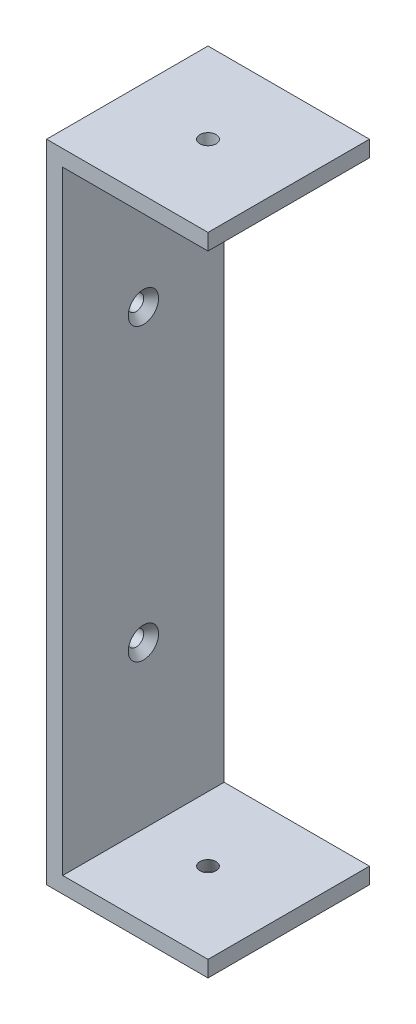
ISO-10303-21;
HEADER;
FILE_DESCRIPTION(('STEP AP214'),'2;1');
FILE_NAME('part.step','',(''),(''),'','','');
FILE_SCHEMA(('AUTOMOTIVE_DESIGN { 1 0 10303 214 1 1 1 1 }'));
ENDSEC;
DATA;
#1=APPLICATION_CONTEXT('core data for automotive mechanical design processes');
#2=APPLICATION_PROTOCOL_DEFINITION('international standard','automotive_design',2000,#1);
#3=PRODUCT_CONTEXT('',#1,'mechanical');
#4=PRODUCT('Part','Part','',(#3));
#5=PRODUCT_RELATED_PRODUCT_CATEGORY('part','',(#4));
#6=PRODUCT_DEFINITION_FORMATION('','',#4);
#7=PRODUCT_DEFINITION_CONTEXT('part definition',#1,'design');
#8=PRODUCT_DEFINITION('design','',#6,#7);
#9=PRODUCT_DEFINITION_SHAPE('','',#8);
#10=(LENGTH_UNIT() NAMED_UNIT(*) SI_UNIT(.MILLI.,.METRE.));
#11=(NAMED_UNIT(*) PLANE_ANGLE_UNIT() SI_UNIT($,.RADIAN.));
#12=(NAMED_UNIT(*) SI_UNIT($,.STERADIAN.) SOLID_ANGLE_UNIT());
#13=UNCERTAINTY_MEASURE_WITH_UNIT(LENGTH_MEASURE(1.E-05),#10,'distance_accuracy_value','');
#14=(GEOMETRIC_REPRESENTATION_CONTEXT(3) GLOBAL_UNCERTAINTY_ASSIGNED_CONTEXT((#13)) GLOBAL_UNIT_ASSIGNED_CONTEXT((#10,
#11,#12)) REPRESENTATION_CONTEXT('',''));
#15=CARTESIAN_POINT('',(0.,0.,0.));
#16=DIRECTION('',(0.,0.,1.));
#17=DIRECTION('',(1.,0.,0.));
#18=AXIS2_PLACEMENT_3D('',#15,#16,#17);
#19=CARTESIAN_POINT('',(50.,200.,0.));
#20=DIRECTION('',(-1.,0.,0.));
#21=DIRECTION('',(0.,0.,1.));
#22=AXIS2_PLACEMENT_3D('',#19,#20,#21);
#23=PLANE('',#22);
#24=DIRECTION('',(0.,-1.,0.));
#25=VECTOR('',#24,1.);
#26=CARTESIAN_POINT('',(50.,200.,-50.));
#27=LINE('',#26,#25);
#28=CARTESIAN_POINT('',(50.,5.,-50.));
#29=VERTEX_POINT('',#28);
#30=CARTESIAN_POINT('',(50.,0.,-50.));
#31=VERTEX_POINT('',#30);
#32=EDGE_CURVE('E127',#29,#31,#27,.T.);
#33=ORIENTED_EDGE('',*,*,#32,.F.);
#34=DIRECTION('',(0.,0.,1.));
#35=VECTOR('',#34,1.);
#36=CARTESIAN_POINT('',(50.,5.,-50.));
#37=LINE('',#36,#35);
#38=CARTESIAN_POINT('',(50.,5.,0.));
#39=VERTEX_POINT('',#38);
#40=EDGE_CURVE('E143',#29,#39,#37,.T.);
#41=ORIENTED_EDGE('',*,*,#40,.T.);
#42=DIRECTION('',(0.,-1.,0.));
#43=VECTOR('',#42,1.);
#44=CARTESIAN_POINT('',(50.,200.,0.));
#45=LINE('',#44,#43);
#46=CARTESIAN_POINT('',(50.,0.,0.));
#47=VERTEX_POINT('',#46);
#48=EDGE_CURVE('E126',#39,#47,#45,.T.);
#49=ORIENTED_EDGE('',*,*,#48,.T.);
#50=DIRECTION('',(0.,0.,-1.));
#51=VECTOR('',#50,1.);
#52=CARTESIAN_POINT('',(50.,0.,0.));
#53=LINE('',#52,#51);
#54=EDGE_CURVE('E134',#47,#31,#53,.T.);
#55=ORIENTED_EDGE('',*,*,#54,.T.);
#56=EDGE_LOOP('',(#33,#41,#49,#55));
#57=FACE_BOUND('',#56,.T.);
#58=ADVANCED_FACE('F35',(#57),#23,.F.);
#59=CARTESIAN_POINT('',(0.,200.,0.));
#60=DIRECTION('',(1.,0.,0.));
#61=DIRECTION('',(0.,0.,-1.));
#62=AXIS2_PLACEMENT_3D('',#59,#60,#61);
#63=PLANE('',#62);
#64=CARTESIAN_POINT('',(0.,145.,-25.));
#65=DIRECTION('',(1.,0.,0.));
#66=DIRECTION('',(0.,0.,-1.));
#67=AXIS2_PLACEMENT_3D('',#64,#65,#66);
#68=CIRCLE('',#67,2.39999999999999);
#69=CARTESIAN_POINT('',(0.,145.,-27.4));
#70=VERTEX_POINT('',#69);
#71=EDGE_CURVE('E184',#70,#70,#68,.T.);
#72=ORIENTED_EDGE('',*,*,#71,.T.);
#73=EDGE_LOOP('',(#72));
#74=FACE_BOUND('',#73,.T.);
#75=CARTESIAN_POINT('',(0.,55.,-25.));
#76=DIRECTION('',(1.,0.,0.));
#77=DIRECTION('',(0.,0.,-1.));
#78=AXIS2_PLACEMENT_3D('',#75,#76,#77);
#79=CIRCLE('',#78,2.39999999999999);
#80=CARTESIAN_POINT('',(0.,55.,-27.4));
#81=VERTEX_POINT('',#80);
#82=EDGE_CURVE('E175',#81,#81,#79,.T.);
#83=ORIENTED_EDGE('',*,*,#82,.T.);
#84=EDGE_LOOP('',(#83));
#85=FACE_BOUND('',#84,.T.);
#86=DIRECTION('',(0.,0.,1.));
#87=VECTOR('',#86,1.);
#88=CARTESIAN_POINT('',(0.,0.,0.));
#89=LINE('',#88,#87);
#90=CARTESIAN_POINT('',(0.,0.,-50.));
#91=VERTEX_POINT('',#90);
#92=CARTESIAN_POINT('',(0.,0.,0.));
#93=VERTEX_POINT('',#92);
#94=EDGE_CURVE('E140',#91,#93,#89,.T.);
#95=ORIENTED_EDGE('',*,*,#94,.T.);
#96=DIRECTION('',(0.,-1.,0.));
#97=VECTOR('',#96,1.);
#98=CARTESIAN_POINT('',(0.,200.,0.));
#99=LINE('',#98,#97);
#100=CARTESIAN_POINT('',(0.,200.,0.));
#101=VERTEX_POINT('',#100);
#102=EDGE_CURVE('E11',#101,#93,#99,.T.);
#103=ORIENTED_EDGE('',*,*,#102,.F.);
#104=DIRECTION('',(0.,0.,1.));
#105=VECTOR('',#104,1.);
#106=CARTESIAN_POINT('',(0.,200.,0.));
#107=LINE('',#106,#105);
#108=CARTESIAN_POINT('',(0.,200.,-50.));
#109=VERTEX_POINT('',#108);
#110=EDGE_CURVE('E133',#109,#101,#107,.T.);
#111=ORIENTED_EDGE('',*,*,#110,.F.);
#112=DIRECTION('',(0.,-1.,0.));
#113=VECTOR('',#112,1.);
#114=CARTESIAN_POINT('',(0.,200.,-50.));
#115=LINE('',#114,#113);
#116=EDGE_CURVE('E129',#109,#91,#115,.T.);
#117=ORIENTED_EDGE('',*,*,#116,.T.);
#118=EDGE_LOOP('',(#95,#103,#111,#117));
#119=FACE_BOUND('',#118,.T.);
#120=ADVANCED_FACE('F37',(#74,#85,#119),#63,.F.);
#121=CARTESIAN_POINT('',(0.,200.,0.));
#122=DIRECTION('',(0.,0.,-1.));
#123=DIRECTION('',(-1.,0.,0.));
#124=AXIS2_PLACEMENT_3D('',#121,#122,#123);
#125=PLANE('',#124);
#126=ORIENTED_EDGE('',*,*,#48,.F.);
#127=DIRECTION('',(1.,0.,0.));
#128=VECTOR('',#127,1.);
#129=CARTESIAN_POINT('',(50.,5.,0.));
#130=LINE('',#129,#128);
#131=CARTESIAN_POINT('',(5.,4.99999999999999,0.));
#132=VERTEX_POINT('',#131);
#133=EDGE_CURVE('E115',#132,#39,#130,.T.);
#134=ORIENTED_EDGE('',*,*,#133,.F.);
#135=DIRECTION('',(0.,-1.,0.));
#136=VECTOR('',#135,1.);
#137=CARTESIAN_POINT('',(5.,4.99999999999999,0.));
#138=LINE('',#137,#136);
#139=CARTESIAN_POINT('',(5.,195.,0.));
#140=VERTEX_POINT('',#139);
#141=EDGE_CURVE('E155',#140,#132,#138,.T.);
#142=ORIENTED_EDGE('',*,*,#141,.F.);
#143=DIRECTION('',(-1.,0.,0.));
#144=VECTOR('',#143,1.);
#145=CARTESIAN_POINT('',(50.,195.,0.));
#146=LINE('',#145,#144);
#147=CARTESIAN_POINT('',(50.,195.,0.));
#148=VERTEX_POINT('',#147);
#149=EDGE_CURVE('E158',#148,#140,#146,.T.);
#150=ORIENTED_EDGE('',*,*,#149,.F.);
#151=CARTESIAN_POINT('',(50.,200.,0.));
#152=VERTEX_POINT('',#151);
#153=EDGE_CURVE('E43',#152,#148,#45,.T.);
#154=ORIENTED_EDGE('',*,*,#153,.F.);
#155=DIRECTION('',(1.,0.,0.));
#156=VECTOR('',#155,1.);
#157=CARTESIAN_POINT('',(0.,200.,0.));
#158=LINE('',#157,#156);
#159=EDGE_CURVE('E86',#101,#152,#158,.T.);
#160=ORIENTED_EDGE('',*,*,#159,.F.);
#161=ORIENTED_EDGE('',*,*,#102,.T.);
#162=DIRECTION('',(1.,0.,0.));
#163=VECTOR('',#162,1.);
#164=CARTESIAN_POINT('',(0.,0.,0.));
#165=LINE('',#164,#163);
#166=EDGE_CURVE('E137',#93,#47,#165,.T.);
#167=ORIENTED_EDGE('',*,*,#166,.T.);
#168=EDGE_LOOP('',(#126,#134,#142,#150,#154,#160,#161,#167));
#169=FACE_BOUND('',#168,.T.);
#170=ADVANCED_FACE('F206',(#169),#125,.F.);
#171=ORIENTED_EDGE('',*,*,#153,.T.);
#172=DIRECTION('',(0.,0.,1.));
#173=VECTOR('',#172,1.);
#174=CARTESIAN_POINT('',(50.,195.,-50.));
#175=LINE('',#174,#173);
#176=CARTESIAN_POINT('',(50.,195.,-50.));
#177=VERTEX_POINT('',#176);
#178=EDGE_CURVE('E111',#177,#148,#175,.T.);
#179=ORIENTED_EDGE('',*,*,#178,.F.);
#180=CARTESIAN_POINT('',(50.,200.,-50.));
#181=VERTEX_POINT('',#180);
#182=EDGE_CURVE('E122',#181,#177,#27,.T.);
#183=ORIENTED_EDGE('',*,*,#182,.F.);
#184=DIRECTION('',(0.,0.,-1.));
#185=VECTOR('',#184,1.);
#186=CARTESIAN_POINT('',(50.,200.,0.));
#187=LINE('',#186,#185);
#188=EDGE_CURVE('E145',#152,#181,#187,.T.);
#189=ORIENTED_EDGE('',*,*,#188,.F.);
#190=EDGE_LOOP('',(#171,#179,#183,#189));
#191=FACE_BOUND('',#190,.T.);
#192=ADVANCED_FACE('F120',(#191),#23,.F.);
#193=CARTESIAN_POINT('',(0.,200.,-50.));
#194=DIRECTION('',(0.,0.,1.));
#195=DIRECTION('',(1.,0.,0.));
#196=AXIS2_PLACEMENT_3D('',#193,#194,#195);
#197=PLANE('',#196);
#198=DIRECTION('',(0.,-1.,0.));
#199=VECTOR('',#198,1.);
#200=CARTESIAN_POINT('',(5.,4.99999999999999,-50.));
#201=LINE('',#200,#199);
#202=CARTESIAN_POINT('',(5.,195.,-50.));
#203=VERTEX_POINT('',#202);
#204=CARTESIAN_POINT('',(5.,4.99999999999999,-50.));
#205=VERTEX_POINT('',#204);
#206=EDGE_CURVE('E50',#203,#205,#201,.T.);
#207=ORIENTED_EDGE('',*,*,#206,.T.);
#208=DIRECTION('',(1.,0.,0.));
#209=VECTOR('',#208,1.);
#210=CARTESIAN_POINT('',(50.,5.,-50.));
#211=LINE('',#210,#209);
#212=EDGE_CURVE('E123',#205,#29,#211,.T.);
#213=ORIENTED_EDGE('',*,*,#212,.T.);
#214=ORIENTED_EDGE('',*,*,#32,.T.);
#215=DIRECTION('',(-1.,0.,0.));
#216=VECTOR('',#215,1.);
#217=CARTESIAN_POINT('',(0.,0.,-50.));
#218=LINE('',#217,#216);
#219=EDGE_CURVE('E79',#31,#91,#218,.T.);
#220=ORIENTED_EDGE('',*,*,#219,.T.);
#221=ORIENTED_EDGE('',*,*,#116,.F.);
#222=DIRECTION('',(-1.,0.,0.));
#223=VECTOR('',#222,1.);
#224=CARTESIAN_POINT('',(0.,200.,-50.));
#225=LINE('',#224,#223);
#226=EDGE_CURVE('E59',#181,#109,#225,.T.);
#227=ORIENTED_EDGE('',*,*,#226,.F.);
#228=ORIENTED_EDGE('',*,*,#182,.T.);
#229=DIRECTION('',(-1.,0.,0.));
#230=VECTOR('',#229,1.);
#231=CARTESIAN_POINT('',(50.,195.,-50.));
#232=LINE('',#231,#230);
#233=EDGE_CURVE('E107',#177,#203,#232,.T.);
#234=ORIENTED_EDGE('',*,*,#233,.T.);
#235=EDGE_LOOP('',(#207,#213,#214,#220,#221,#227,#228,#234));
#236=FACE_BOUND('',#235,.T.);
#237=ADVANCED_FACE('F125',(#236),#197,.F.);
#238=CARTESIAN_POINT('',(0.,200.,0.));
#239=DIRECTION('',(0.,-1.,0.));
#240=DIRECTION('',(0.,0.,-1.));
#241=AXIS2_PLACEMENT_3D('',#238,#239,#240);
#242=PLANE('',#241);
#243=CARTESIAN_POINT('',(25.,200.,-25.));
#244=DIRECTION('',(0.,1.,0.));
#245=DIRECTION('',(0.,0.,1.));
#246=AXIS2_PLACEMENT_3D('',#243,#244,#245);
#247=CIRCLE('',#246,2.5);
#248=CARTESIAN_POINT('',(25.,200.,-22.5));
#249=VERTEX_POINT('',#248);
#250=EDGE_CURVE('E164',#249,#249,#247,.T.);
#251=ORIENTED_EDGE('',*,*,#250,.F.);
#252=EDGE_LOOP('',(#251));
#253=FACE_BOUND('',#252,.T.);
#254=ORIENTED_EDGE('',*,*,#110,.T.);
#255=ORIENTED_EDGE('',*,*,#159,.T.);
#256=ORIENTED_EDGE('',*,*,#188,.T.);
#257=ORIENTED_EDGE('',*,*,#226,.T.);
#258=EDGE_LOOP('',(#254,#255,#256,#257));
#259=FACE_BOUND('',#258,.T.);
#260=ADVANCED_FACE('F217',(#253,#259),#242,.F.);
#261=CARTESIAN_POINT('',(0.,0.,0.));
#262=DIRECTION('',(0.,-1.,0.));
#263=DIRECTION('',(0.,0.,-1.));
#264=AXIS2_PLACEMENT_3D('',#261,#262,#263);
#265=PLANE('',#264);
#266=CARTESIAN_POINT('',(25.,0.,-25.));
#267=DIRECTION('',(0.,1.,0.));
#268=DIRECTION('',(-1.,0.,0.));
#269=AXIS2_PLACEMENT_3D('',#266,#267,#268);
#270=CIRCLE('',#269,4.83153829077499);
#271=CARTESIAN_POINT('',(20.1684617092251,0.,-25.));
#272=VERTEX_POINT('',#271);
#273=EDGE_CURVE('E167',#272,#272,#270,.T.);
#274=ORIENTED_EDGE('',*,*,#273,.T.);
#275=EDGE_LOOP('',(#274));
#276=FACE_BOUND('',#275,.T.);
#277=ORIENTED_EDGE('',*,*,#94,.F.);
#278=ORIENTED_EDGE('',*,*,#219,.F.);
#279=ORIENTED_EDGE('',*,*,#54,.F.);
#280=ORIENTED_EDGE('',*,*,#166,.F.);
#281=EDGE_LOOP('',(#277,#278,#279,#280));
#282=FACE_BOUND('',#281,.T.);
#283=ADVANCED_FACE('F213',(#276,#282),#265,.T.);
#284=CARTESIAN_POINT('',(50.,5.,-50.));
#285=DIRECTION('',(0.,-1.,0.));
#286=DIRECTION('',(1.,0.,0.));
#287=AXIS2_PLACEMENT_3D('',#284,#285,#286);
#288=PLANE('',#287);
#289=CARTESIAN_POINT('',(25.,5.,-25.));
#290=DIRECTION('',(0.,1.,0.));
#291=DIRECTION('',(-1.,0.,0.));
#292=AXIS2_PLACEMENT_3D('',#289,#290,#291);
#293=CIRCLE('',#292,2.5);
#294=CARTESIAN_POINT('',(22.5,5.,-25.));
#295=VERTEX_POINT('',#294);
#296=EDGE_CURVE('E172',#295,#295,#293,.T.);
#297=ORIENTED_EDGE('',*,*,#296,.F.);
#298=EDGE_LOOP('',(#297));
#299=FACE_BOUND('',#298,.T.);
#300=ORIENTED_EDGE('',*,*,#133,.T.);
#301=ORIENTED_EDGE('',*,*,#40,.F.);
#302=ORIENTED_EDGE('',*,*,#212,.F.);
#303=DIRECTION('',(0.,0.,1.));
#304=VECTOR('',#303,1.);
#305=CARTESIAN_POINT('',(5.,4.99999999999999,-50.));
#306=LINE('',#305,#304);
#307=EDGE_CURVE('E150',#205,#132,#306,.T.);
#308=ORIENTED_EDGE('',*,*,#307,.T.);
#309=EDGE_LOOP('',(#300,#301,#302,#308));
#310=FACE_BOUND('',#309,.T.);
#311=ADVANCED_FACE('F199',(#299,#310),#288,.F.);
#312=CARTESIAN_POINT('',(5.,4.99999999999999,-50.));
#313=DIRECTION('',(-1.,0.,0.));
#314=DIRECTION('',(0.,0.,1.));
#315=AXIS2_PLACEMENT_3D('',#312,#313,#314);
#316=PLANE('',#315);
#317=CARTESIAN_POINT('',(5.,145.,-25.));
#318=DIRECTION('',(1.,0.,0.));
#319=DIRECTION('',(0.,0.,-1.));
#320=AXIS2_PLACEMENT_3D('',#317,#318,#319);
#321=CIRCLE('',#320,4.70000000000001);
#322=CARTESIAN_POINT('',(5.,145.,-29.7));
#323=VERTEX_POINT('',#322);
#324=EDGE_CURVE('E190',#323,#323,#321,.T.);
#325=ORIENTED_EDGE('',*,*,#324,.F.);
#326=EDGE_LOOP('',(#325));
#327=FACE_BOUND('',#326,.T.);
#328=CARTESIAN_POINT('',(5.,55.,-25.));
#329=DIRECTION('',(1.,0.,0.));
#330=DIRECTION('',(0.,0.,-1.));
#331=AXIS2_PLACEMENT_3D('',#328,#329,#330);
#332=CIRCLE('',#331,4.7);
#333=CARTESIAN_POINT('',(5.,55.,-29.7));
#334=VERTEX_POINT('',#333);
#335=EDGE_CURVE('E181',#334,#334,#332,.T.);
#336=ORIENTED_EDGE('',*,*,#335,.F.);
#337=EDGE_LOOP('',(#336));
#338=FACE_BOUND('',#337,.T.);
#339=ORIENTED_EDGE('',*,*,#141,.T.);
#340=ORIENTED_EDGE('',*,*,#307,.F.);
#341=ORIENTED_EDGE('',*,*,#206,.F.);
#342=DIRECTION('',(0.,0.,1.));
#343=VECTOR('',#342,1.);
#344=CARTESIAN_POINT('',(5.,195.,-50.));
#345=LINE('',#344,#343);
#346=EDGE_CURVE('E113',#203,#140,#345,.T.);
#347=ORIENTED_EDGE('',*,*,#346,.T.);
#348=EDGE_LOOP('',(#339,#340,#341,#347));
#349=FACE_BOUND('',#348,.T.);
#350=ADVANCED_FACE('F196',(#327,#338,#349),#316,.F.);
#351=CARTESIAN_POINT('',(50.,195.,-50.));
#352=DIRECTION('',(0.,1.,0.));
#353=DIRECTION('',(0.,0.,1.));
#354=AXIS2_PLACEMENT_3D('',#351,#352,#353);
#355=PLANE('',#354);
#356=CARTESIAN_POINT('',(25.,195.,-25.));
#357=DIRECTION('',(0.,1.,0.));
#358=DIRECTION('',(0.,0.,1.));
#359=AXIS2_PLACEMENT_3D('',#356,#357,#358);
#360=CIRCLE('',#359,2.5);
#361=CARTESIAN_POINT('',(25.,195.,-22.5));
#362=VERTEX_POINT('',#361);
#363=EDGE_CURVE('E160',#362,#362,#360,.T.);
#364=ORIENTED_EDGE('',*,*,#363,.T.);
#365=EDGE_LOOP('',(#364));
#366=FACE_BOUND('',#365,.T.);
#367=ORIENTED_EDGE('',*,*,#149,.T.);
#368=ORIENTED_EDGE('',*,*,#346,.F.);
#369=ORIENTED_EDGE('',*,*,#233,.F.);
#370=ORIENTED_EDGE('',*,*,#178,.T.);
#371=EDGE_LOOP('',(#367,#368,#369,#370));
#372=FACE_BOUND('',#371,.T.);
#373=ADVANCED_FACE('F110',(#366,#372),#355,.F.);
#374=CARTESIAN_POINT('',(25.,195.,-25.));
#375=DIRECTION('',(0.,1.,0.));
#376=DIRECTION('',(0.,0.,1.));
#377=AXIS2_PLACEMENT_3D('',#374,#375,#376);
#378=CYLINDRICAL_SURFACE('',#377,2.5);
#379=ORIENTED_EDGE('',*,*,#363,.F.);
#380=EDGE_LOOP('',(#379));
#381=FACE_BOUND('',#380,.T.);
#382=ORIENTED_EDGE('',*,*,#250,.T.);
#383=EDGE_LOOP('',(#382));
#384=FACE_BOUND('',#383,.T.);
#385=ADVANCED_FACE('F308',(#381,#384),#378,.F.);
#386=CARTESIAN_POINT('',(25.,5.,-25.));
#387=DIRECTION('',(0.,-1.,0.));
#388=DIRECTION('',(-1.,0.,0.));
#389=AXIS2_PLACEMENT_3D('',#386,#387,#388);
#390=CONICAL_SURFACE('',#389,2.5,0.436332312998583);
#391=ORIENTED_EDGE('',*,*,#273,.F.);
#392=EDGE_LOOP('',(#391));
#393=FACE_BOUND('',#392,.T.);
#394=ORIENTED_EDGE('',*,*,#296,.T.);
#395=EDGE_LOOP('',(#394));
#396=FACE_BOUND('',#395,.T.);
#397=ADVANCED_FACE('F252',(#393,#396),#390,.F.);
#398=CARTESIAN_POINT('',(5.,55.,-25.));
#399=DIRECTION('',(1.,0.,0.));
#400=DIRECTION('',(0.,0.,-1.));
#401=AXIS2_PLACEMENT_3D('',#398,#399,#400);
#402=CYLINDRICAL_SURFACE('',#401,2.39999999999999);
#403=ORIENTED_EDGE('',*,*,#82,.F.);
#404=EDGE_LOOP('',(#403));
#405=FACE_BOUND('',#404,.T.);
#406=CARTESIAN_POINT('',(2.69999999999997,55.,-25.));
#407=DIRECTION('',(1.,0.,0.));
#408=DIRECTION('',(0.,0.,-1.));
#409=AXIS2_PLACEMENT_3D('',#406,#407,#408);
#410=CIRCLE('',#409,2.39999999999999);
#411=CARTESIAN_POINT('',(2.69999999999997,55.,-27.4));
#412=VERTEX_POINT('',#411);
#413=EDGE_CURVE('E178',#412,#412,#410,.T.);
#414=ORIENTED_EDGE('',*,*,#413,.T.);
#415=EDGE_LOOP('',(#414));
#416=FACE_BOUND('',#415,.T.);
#417=ADVANCED_FACE('F267',(#405,#416),#402,.F.);
#418=CARTESIAN_POINT('',(5.,55.,-25.));
#419=DIRECTION('',(1.,0.,0.));
#420=DIRECTION('',(0.,0.,-1.));
#421=AXIS2_PLACEMENT_3D('',#418,#419,#420);
#422=CONICAL_SURFACE('',#421,4.7,0.785398163397446);
#423=ORIENTED_EDGE('',*,*,#413,.F.);
#424=EDGE_LOOP('',(#423));
#425=FACE_BOUND('',#424,.T.);
#426=ORIENTED_EDGE('',*,*,#335,.T.);
#427=EDGE_LOOP('',(#426));
#428=FACE_BOUND('',#427,.T.);
#429=ADVANCED_FACE('F272',(#425,#428),#422,.F.);
#430=CARTESIAN_POINT('',(5.,145.,-25.));
#431=DIRECTION('',(1.,0.,0.));
#432=DIRECTION('',(0.,0.,-1.));
#433=AXIS2_PLACEMENT_3D('',#430,#431,#432);
#434=CYLINDRICAL_SURFACE('',#433,2.39999999999999);
#435=ORIENTED_EDGE('',*,*,#71,.F.);
#436=EDGE_LOOP('',(#435));
#437=FACE_BOUND('',#436,.T.);
#438=CARTESIAN_POINT('',(2.69999999999997,145.,-25.));
#439=DIRECTION('',(1.,0.,0.));
#440=DIRECTION('',(0.,0.,-1.));
#441=AXIS2_PLACEMENT_3D('',#438,#439,#440);
#442=CIRCLE('',#441,2.39999999999999);
#443=CARTESIAN_POINT('',(2.69999999999997,145.,-27.4));
#444=VERTEX_POINT('',#443);
#445=EDGE_CURVE('E187',#444,#444,#442,.T.);
#446=ORIENTED_EDGE('',*,*,#445,.T.);
#447=EDGE_LOOP('',(#446));
#448=FACE_BOUND('',#447,.T.);
#449=ADVANCED_FACE('F282',(#437,#448),#434,.F.);
#450=CARTESIAN_POINT('',(5.,145.,-25.));
#451=DIRECTION('',(1.,0.,0.));
#452=DIRECTION('',(0.,0.,-1.));
#453=AXIS2_PLACEMENT_3D('',#450,#451,#452);
#454=CONICAL_SURFACE('',#453,4.70000000000001,0.785398163397448);
#455=ORIENTED_EDGE('',*,*,#445,.F.);
#456=EDGE_LOOP('',(#455));
#457=FACE_BOUND('',#456,.T.);
#458=ORIENTED_EDGE('',*,*,#324,.T.);
#459=EDGE_LOOP('',(#458));
#460=FACE_BOUND('',#459,.T.);
#461=ADVANCED_FACE('F194',(#457,#460),#454,.F.);
#462=CLOSED_SHELL('',(#58,#120,#170,#192,#237,#260,#283,#311,#350,#373,#385,#397,#417,#429,#449,#461));
#463=MANIFOLD_SOLID_BREP('B2',#462);
#464=ADVANCED_BREP_SHAPE_REPRESENTATION('',(#18,#463),#14);
#465=SHAPE_DEFINITION_REPRESENTATION(#9,#464);
ENDSEC;
END-ISO-10303-21;
